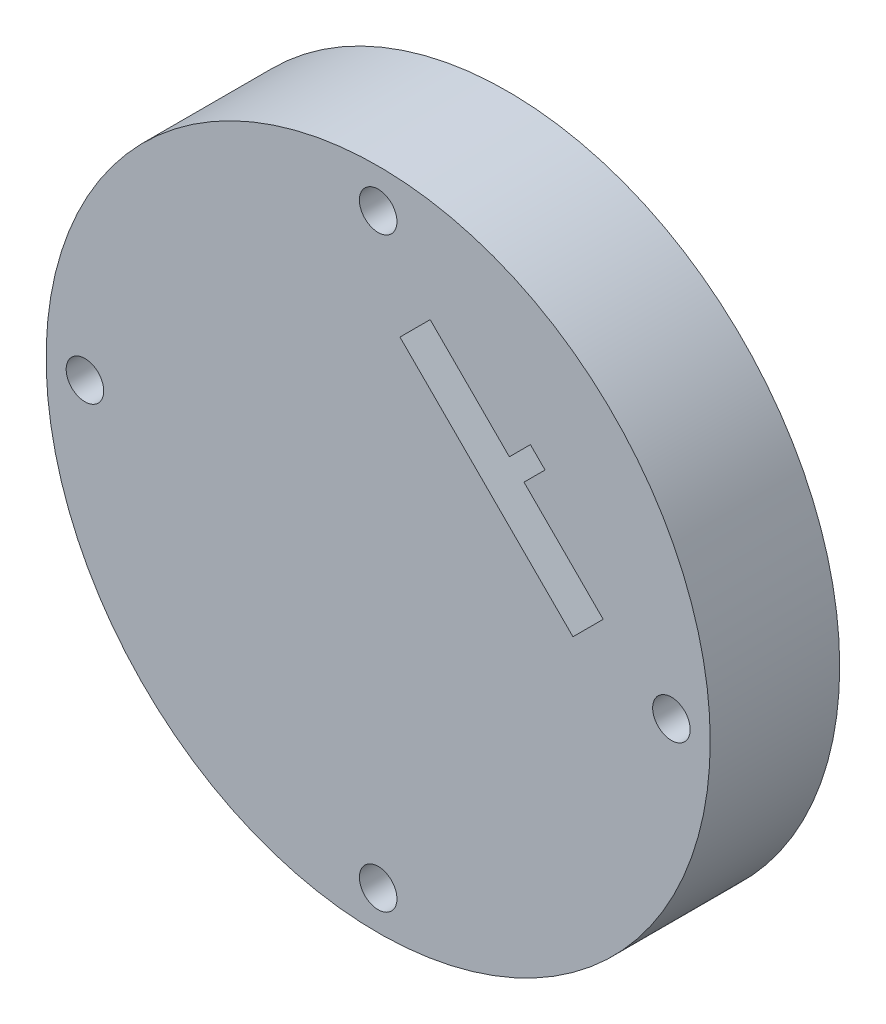
ISO-10303-21;
HEADER;
FILE_DESCRIPTION(('STEP AP214'),'2;1');
FILE_NAME('part.step','',(''),(''),'','','');
FILE_SCHEMA(('AUTOMOTIVE_DESIGN { 1 0 10303 214 1 1 1 1 }'));
ENDSEC;
DATA;
#1=APPLICATION_CONTEXT('core data for automotive mechanical design processes');
#2=APPLICATION_PROTOCOL_DEFINITION('international standard','automotive_design',2000,#1);
#3=PRODUCT_CONTEXT('',#1,'mechanical');
#4=PRODUCT('Part','Part','',(#3));
#5=PRODUCT_RELATED_PRODUCT_CATEGORY('part','',(#4));
#6=PRODUCT_DEFINITION_FORMATION('','',#4);
#7=PRODUCT_DEFINITION_CONTEXT('part definition',#1,'design');
#8=PRODUCT_DEFINITION('design','',#6,#7);
#9=PRODUCT_DEFINITION_SHAPE('','',#8);
#10=(LENGTH_UNIT() NAMED_UNIT(*) SI_UNIT(.MILLI.,.METRE.));
#11=(NAMED_UNIT(*) PLANE_ANGLE_UNIT() SI_UNIT($,.RADIAN.));
#12=(NAMED_UNIT(*) SI_UNIT($,.STERADIAN.) SOLID_ANGLE_UNIT());
#13=UNCERTAINTY_MEASURE_WITH_UNIT(LENGTH_MEASURE(1.E-05),#10,'distance_accuracy_value','');
#14=(GEOMETRIC_REPRESENTATION_CONTEXT(3) GLOBAL_UNCERTAINTY_ASSIGNED_CONTEXT((#13)) GLOBAL_UNIT_ASSIGNED_CONTEXT((#10,
#11,#12)) REPRESENTATION_CONTEXT('',''));
#15=CARTESIAN_POINT('',(0.,0.,0.));
#16=DIRECTION('',(0.,0.,1.));
#17=DIRECTION('',(1.,0.,0.));
#18=AXIS2_PLACEMENT_3D('',#15,#16,#17);
#19=CARTESIAN_POINT('',(0.,0.,10.));
#20=DIRECTION('',(0.,0.,1.));
#21=DIRECTION('',(1.,0.,0.));
#22=AXIS2_PLACEMENT_3D('',#19,#20,#21);
#23=PLANE('',#22);
#24=DIRECTION('',(-0.707106781186547,0.707106781186548,0.));
#25=VECTOR('',#24,1.);
#26=CARTESIAN_POINT('',(17.3806846815653,4.0163665171396,10.));
#27=LINE('',#26,#25);
#28=CARTESIAN_POINT('',(17.3806846815653,4.0163665171396,10.));
#29=VERTEX_POINT('',#28);
#30=CARTESIAN_POINT('',(11.2642110243017,10.1328401744032,10.));
#31=VERTEX_POINT('',#30);
#32=EDGE_CURVE('E54',#29,#31,#27,.T.);
#33=ORIENTED_EDGE('',*,*,#32,.F.);
#34=DIRECTION('',(0.707106781186546,0.707106781186549,0.));
#35=VECTOR('',#34,1.);
#36=CARTESIAN_POINT('',(17.3806846815653,4.0163665171396,10.));
#37=LINE('',#36,#35);
#38=CARTESIAN_POINT('',(15.0472323036497,1.68291413922398,10.));
#39=VERTEX_POINT('',#38);
#40=EDGE_CURVE('E155',#39,#29,#37,.T.);
#41=ORIENTED_EDGE('',*,*,#40,.F.);
#42=DIRECTION('',(0.707106781186548,-0.707106781186548,0.));
#43=VECTOR('',#42,1.);
#44=CARTESIAN_POINT('',(1.68291413922399,15.0472323036497,10.));
#45=LINE('',#44,#43);
#46=CARTESIAN_POINT('',(1.68291413922399,15.0472323036497,10.));
#47=VERTEX_POINT('',#46);
#48=EDGE_CURVE('E153',#47,#39,#45,.T.);
#49=ORIENTED_EDGE('',*,*,#48,.F.);
#50=DIRECTION('',(-0.707106781186547,-0.707106781186548,0.));
#51=VECTOR('',#50,1.);
#52=CARTESIAN_POINT('',(4.01636651713959,17.3806846815653,10.));
#53=LINE('',#52,#51);
#54=CARTESIAN_POINT('',(4.01636651713959,17.3806846815653,10.));
#55=VERTEX_POINT('',#54);
#56=EDGE_CURVE('E114',#55,#47,#53,.T.);
#57=ORIENTED_EDGE('',*,*,#56,.F.);
#58=DIRECTION('',(-0.707106781186548,0.707106781186547,0.));
#59=VECTOR('',#58,1.);
#60=CARTESIAN_POINT('',(10.1328401744032,11.2642110243017,10.));
#61=LINE('',#60,#59);
#62=CARTESIAN_POINT('',(10.1328401744032,11.2642110243017,10.));
#63=VERTEX_POINT('',#62);
#64=EDGE_CURVE('E149',#63,#55,#61,.T.);
#65=ORIENTED_EDGE('',*,*,#64,.F.);
#66=DIRECTION('',(-0.70710678118655,-0.707106781186545,0.));
#67=VECTOR('',#66,1.);
#68=CARTESIAN_POINT('',(10.1328401744032,11.2642110243017,10.));
#69=LINE('',#68,#67);
#70=CARTESIAN_POINT('',(11.7591857711323,12.8905566210308,10.));
#71=VERTEX_POINT('',#70);
#72=EDGE_CURVE('E146',#71,#63,#69,.T.);
#73=ORIENTED_EDGE('',*,*,#72,.F.);
#74=DIRECTION('',(-0.707106781186547,0.707106781186547,0.));
#75=VECTOR('',#74,1.);
#76=CARTESIAN_POINT('',(12.8905566210308,11.7591857711323,10.));
#77=LINE('',#76,#75);
#78=CARTESIAN_POINT('',(12.8905566210308,11.7591857711323,10.));
#79=VERTEX_POINT('',#78);
#80=EDGE_CURVE('E143',#79,#71,#77,.T.);
#81=ORIENTED_EDGE('',*,*,#80,.F.);
#82=DIRECTION('',(0.707106781186547,0.707106781186547,0.));
#83=VECTOR('',#82,1.);
#84=CARTESIAN_POINT('',(11.2642110243017,10.1328401744032,10.));
#85=LINE('',#84,#83);
#86=EDGE_CURVE('E140',#31,#79,#85,.T.);
#87=ORIENTED_EDGE('',*,*,#86,.F.);
#88=EDGE_LOOP('',(#33,#41,#49,#57,#65,#73,#81,#87));
#89=FACE_BOUND('',#88,.T.);
#90=CARTESIAN_POINT('',(2.37246156974391E-13,22.65,10.));
#91=DIRECTION('',(0.,0.,1.));
#92=DIRECTION('',(1.,0.,0.));
#93=AXIS2_PLACEMENT_3D('',#90,#91,#92);
#94=CIRCLE('',#93,1.45);
#95=CARTESIAN_POINT('',(1.45000000000024,22.65,10.));
#96=VERTEX_POINT('',#95);
#97=EDGE_CURVE('E175',#96,#96,#94,.T.);
#98=ORIENTED_EDGE('',*,*,#97,.F.);
#99=EDGE_LOOP('',(#98));
#100=FACE_BOUND('',#99,.T.);
#101=CARTESIAN_POINT('',(0.,-22.65,10.));
#102=DIRECTION('',(0.,0.,1.));
#103=DIRECTION('',(1.,0.,0.));
#104=AXIS2_PLACEMENT_3D('',#101,#102,#103);
#105=CIRCLE('',#104,1.45);
#106=CARTESIAN_POINT('',(1.44999999999992,-22.65,10.));
#107=VERTEX_POINT('',#106);
#108=EDGE_CURVE('E187',#107,#107,#105,.T.);
#109=ORIENTED_EDGE('',*,*,#108,.F.);
#110=EDGE_LOOP('',(#109));
#111=FACE_BOUND('',#110,.T.);
#112=CARTESIAN_POINT('',(0.,0.,10.));
#113=DIRECTION('',(0.,0.,1.));
#114=DIRECTION('',(1.,0.,0.));
#115=AXIS2_PLACEMENT_3D('',#112,#113,#114);
#116=CIRCLE('',#115,25.65);
#117=CARTESIAN_POINT('',(25.65,0.,10.));
#118=VERTEX_POINT('',#117);
#119=EDGE_CURVE('E11',#118,#118,#116,.T.);
#120=ORIENTED_EDGE('',*,*,#119,.T.);
#121=EDGE_LOOP('',(#120));
#122=FACE_BOUND('',#121,.T.);
#123=CARTESIAN_POINT('',(22.65,0.,10.));
#124=DIRECTION('',(0.,0.,1.));
#125=DIRECTION('',(1.,0.,0.));
#126=AXIS2_PLACEMENT_3D('',#123,#124,#125);
#127=CIRCLE('',#126,1.45);
#128=CARTESIAN_POINT('',(24.1,0.,10.));
#129=VERTEX_POINT('',#128);
#130=EDGE_CURVE('E181',#129,#129,#127,.T.);
#131=ORIENTED_EDGE('',*,*,#130,.F.);
#132=EDGE_LOOP('',(#131));
#133=FACE_BOUND('',#132,.T.);
#134=CARTESIAN_POINT('',(-22.65,1.58164104649594E-13,10.));
#135=DIRECTION('',(0.,0.,1.));
#136=DIRECTION('',(1.,0.,0.));
#137=AXIS2_PLACEMENT_3D('',#134,#135,#136);
#138=CIRCLE('',#137,1.45);
#139=CARTESIAN_POINT('',(-21.2,1.58164104649594E-13,10.));
#140=VERTEX_POINT('',#139);
#141=EDGE_CURVE('E169',#140,#140,#138,.T.);
#142=ORIENTED_EDGE('',*,*,#141,.F.);
#143=EDGE_LOOP('',(#142));
#144=FACE_BOUND('',#143,.T.);
#145=ADVANCED_FACE('F39',(#89,#100,#111,#122,#133,#144),#23,.T.);
#146=CARTESIAN_POINT('',(0.,0.,0.));
#147=DIRECTION('',(0.,0.,1.));
#148=DIRECTION('',(1.,0.,0.));
#149=AXIS2_PLACEMENT_3D('',#146,#147,#148);
#150=PLANE('',#149);
#151=CARTESIAN_POINT('',(0.,0.,0.));
#152=DIRECTION('',(0.,0.,1.));
#153=DIRECTION('',(1.,0.,0.));
#154=AXIS2_PLACEMENT_3D('',#151,#152,#153);
#155=CIRCLE('',#154,25.65);
#156=CARTESIAN_POINT('',(25.65,0.,0.));
#157=VERTEX_POINT('',#156);
#158=EDGE_CURVE('E43',#157,#157,#155,.T.);
#159=ORIENTED_EDGE('',*,*,#158,.F.);
#160=EDGE_LOOP('',(#159));
#161=FACE_BOUND('',#160,.T.);
#162=CARTESIAN_POINT('',(0.,-22.65,0.));
#163=DIRECTION('',(0.,0.,1.));
#164=DIRECTION('',(1.,0.,0.));
#165=AXIS2_PLACEMENT_3D('',#162,#163,#164);
#166=CIRCLE('',#165,1.45);
#167=CARTESIAN_POINT('',(1.44999999999992,-22.65,0.));
#168=VERTEX_POINT('',#167);
#169=EDGE_CURVE('E184',#168,#168,#166,.T.);
#170=ORIENTED_EDGE('',*,*,#169,.T.);
#171=EDGE_LOOP('',(#170));
#172=FACE_BOUND('',#171,.T.);
#173=CARTESIAN_POINT('',(22.65,0.,0.));
#174=DIRECTION('',(0.,0.,1.));
#175=DIRECTION('',(1.,0.,0.));
#176=AXIS2_PLACEMENT_3D('',#173,#174,#175);
#177=CIRCLE('',#176,1.45);
#178=CARTESIAN_POINT('',(24.1,0.,0.));
#179=VERTEX_POINT('',#178);
#180=EDGE_CURVE('E178',#179,#179,#177,.T.);
#181=ORIENTED_EDGE('',*,*,#180,.T.);
#182=EDGE_LOOP('',(#181));
#183=FACE_BOUND('',#182,.T.);
#184=CARTESIAN_POINT('',(2.37246156974391E-13,22.65,0.));
#185=DIRECTION('',(0.,0.,1.));
#186=DIRECTION('',(1.,0.,0.));
#187=AXIS2_PLACEMENT_3D('',#184,#185,#186);
#188=CIRCLE('',#187,1.45);
#189=CARTESIAN_POINT('',(1.45000000000024,22.65,0.));
#190=VERTEX_POINT('',#189);
#191=EDGE_CURVE('E172',#190,#190,#188,.T.);
#192=ORIENTED_EDGE('',*,*,#191,.T.);
#193=EDGE_LOOP('',(#192));
#194=FACE_BOUND('',#193,.T.);
#195=CARTESIAN_POINT('',(-22.65,1.58164104649594E-13,0.));
#196=DIRECTION('',(0.,0.,1.));
#197=DIRECTION('',(1.,0.,0.));
#198=AXIS2_PLACEMENT_3D('',#195,#196,#197);
#199=CIRCLE('',#198,1.45);
#200=CARTESIAN_POINT('',(-21.2,1.58164104649594E-13,0.));
#201=VERTEX_POINT('',#200);
#202=EDGE_CURVE('E159',#201,#201,#199,.T.);
#203=ORIENTED_EDGE('',*,*,#202,.T.);
#204=EDGE_LOOP('',(#203));
#205=FACE_BOUND('',#204,.T.);
#206=ADVANCED_FACE('F193',(#161,#172,#183,#194,#205),#150,.F.);
#207=CARTESIAN_POINT('',(0.,0.,10.));
#208=DIRECTION('',(0.,0.,-1.));
#209=DIRECTION('',(-1.,0.,0.));
#210=AXIS2_PLACEMENT_3D('',#207,#208,#209);
#211=CYLINDRICAL_SURFACE('',#210,25.65);
#212=ORIENTED_EDGE('',*,*,#119,.F.);
#213=EDGE_LOOP('',(#212));
#214=FACE_BOUND('',#213,.T.);
#215=ORIENTED_EDGE('',*,*,#158,.T.);
#216=EDGE_LOOP('',(#215));
#217=FACE_BOUND('',#216,.T.);
#218=ADVANCED_FACE('F41',(#214,#217),#211,.T.);
#219=CARTESIAN_POINT('',(0.,-22.65,10.));
#220=DIRECTION('',(0.,0.,-1.));
#221=DIRECTION('',(-1.,0.,0.));
#222=AXIS2_PLACEMENT_3D('',#219,#220,#221);
#223=CYLINDRICAL_SURFACE('',#222,1.45);
#224=ORIENTED_EDGE('',*,*,#108,.T.);
#225=EDGE_LOOP('',(#224));
#226=FACE_BOUND('',#225,.T.);
#227=ORIENTED_EDGE('',*,*,#169,.F.);
#228=EDGE_LOOP('',(#227));
#229=FACE_BOUND('',#228,.T.);
#230=ADVANCED_FACE('F196',(#226,#229),#223,.F.);
#231=CARTESIAN_POINT('',(22.65,0.,10.));
#232=DIRECTION('',(0.,0.,-1.));
#233=DIRECTION('',(-1.,0.,0.));
#234=AXIS2_PLACEMENT_3D('',#231,#232,#233);
#235=CYLINDRICAL_SURFACE('',#234,1.45);
#236=ORIENTED_EDGE('',*,*,#130,.T.);
#237=EDGE_LOOP('',(#236));
#238=FACE_BOUND('',#237,.T.);
#239=ORIENTED_EDGE('',*,*,#180,.F.);
#240=EDGE_LOOP('',(#239));
#241=FACE_BOUND('',#240,.T.);
#242=ADVANCED_FACE('F198',(#238,#241),#235,.F.);
#243=CARTESIAN_POINT('',(2.37246156974391E-13,22.65,10.));
#244=DIRECTION('',(0.,0.,-1.));
#245=DIRECTION('',(-1.,0.,0.));
#246=AXIS2_PLACEMENT_3D('',#243,#244,#245);
#247=CYLINDRICAL_SURFACE('',#246,1.45);
#248=ORIENTED_EDGE('',*,*,#97,.T.);
#249=EDGE_LOOP('',(#248));
#250=FACE_BOUND('',#249,.T.);
#251=ORIENTED_EDGE('',*,*,#191,.F.);
#252=EDGE_LOOP('',(#251));
#253=FACE_BOUND('',#252,.T.);
#254=ADVANCED_FACE('F205',(#250,#253),#247,.F.);
#255=CARTESIAN_POINT('',(-22.65,1.58164104649594E-13,10.));
#256=DIRECTION('',(0.,0.,-1.));
#257=DIRECTION('',(-1.,0.,0.));
#258=AXIS2_PLACEMENT_3D('',#255,#256,#257);
#259=CYLINDRICAL_SURFACE('',#258,1.45);
#260=ORIENTED_EDGE('',*,*,#141,.T.);
#261=EDGE_LOOP('',(#260));
#262=FACE_BOUND('',#261,.T.);
#263=ORIENTED_EDGE('',*,*,#202,.F.);
#264=EDGE_LOOP('',(#263));
#265=FACE_BOUND('',#264,.T.);
#266=ADVANCED_FACE('F231',(#262,#265),#259,.F.);
#267=CARTESIAN_POINT('',(17.3806846815653,4.0163665171396,2.5));
#268=DIRECTION('',(0.707106781186548,0.707106781186547,0.));
#269=DIRECTION('',(-0.707106781186547,0.707106781186548,0.));
#270=AXIS2_PLACEMENT_3D('',#267,#268,#269);
#271=PLANE('',#270);
#272=ORIENTED_EDGE('',*,*,#32,.T.);
#273=DIRECTION('',(0.,0.,1.));
#274=VECTOR('',#273,1.);
#275=CARTESIAN_POINT('',(11.2642110243017,10.1328401744032,2.5));
#276=LINE('',#275,#274);
#277=CARTESIAN_POINT('',(11.2642110243017,10.1328401744032,2.5));
#278=VERTEX_POINT('',#277);
#279=EDGE_CURVE('E90',#278,#31,#276,.T.);
#280=ORIENTED_EDGE('',*,*,#279,.F.);
#281=DIRECTION('',(-0.707106781186547,0.707106781186548,0.));
#282=VECTOR('',#281,1.);
#283=CARTESIAN_POINT('',(17.3806846815653,4.0163665171396,2.5));
#284=LINE('',#283,#282);
#285=CARTESIAN_POINT('',(17.3806846815653,4.0163665171396,2.5));
#286=VERTEX_POINT('',#285);
#287=EDGE_CURVE('E157',#286,#278,#284,.T.);
#288=ORIENTED_EDGE('',*,*,#287,.F.);
#289=DIRECTION('',(0.,0.,1.));
#290=VECTOR('',#289,1.);
#291=CARTESIAN_POINT('',(17.3806846815653,4.0163665171396,2.5));
#292=LINE('',#291,#290);
#293=EDGE_CURVE('E62',#286,#29,#292,.T.);
#294=ORIENTED_EDGE('',*,*,#293,.T.);
#295=EDGE_LOOP('',(#272,#280,#288,#294));
#296=FACE_BOUND('',#295,.T.);
#297=ADVANCED_FACE('F233',(#296),#271,.F.);
#298=CARTESIAN_POINT('',(17.3806846815653,4.0163665171396,2.5));
#299=DIRECTION('',(0.707106781186549,-0.707106781186546,0.));
#300=DIRECTION('',(0.707106781186546,0.707106781186549,0.));
#301=AXIS2_PLACEMENT_3D('',#298,#299,#300);
#302=PLANE('',#301);
#303=ORIENTED_EDGE('',*,*,#40,.T.);
#304=ORIENTED_EDGE('',*,*,#293,.F.);
#305=DIRECTION('',(0.707106781186546,0.707106781186549,0.));
#306=VECTOR('',#305,1.);
#307=CARTESIAN_POINT('',(17.3806846815653,4.0163665171396,2.5));
#308=LINE('',#307,#306);
#309=CARTESIAN_POINT('',(15.0472323036497,1.68291413922398,2.5));
#310=VERTEX_POINT('',#309);
#311=EDGE_CURVE('E126',#310,#286,#308,.T.);
#312=ORIENTED_EDGE('',*,*,#311,.F.);
#313=DIRECTION('',(0.,0.,1.));
#314=VECTOR('',#313,1.);
#315=CARTESIAN_POINT('',(15.0472323036497,1.68291413922398,2.5));
#316=LINE('',#315,#314);
#317=EDGE_CURVE('E118',#310,#39,#316,.T.);
#318=ORIENTED_EDGE('',*,*,#317,.T.);
#319=EDGE_LOOP('',(#303,#304,#312,#318));
#320=FACE_BOUND('',#319,.T.);
#321=ADVANCED_FACE('F240',(#320),#302,.F.);
#322=CARTESIAN_POINT('',(1.68291413922399,15.0472323036497,2.5));
#323=DIRECTION('',(-0.707106781186547,-0.707106781186547,0.));
#324=DIRECTION('',(0.707106781186548,-0.707106781186548,0.));
#325=AXIS2_PLACEMENT_3D('',#322,#323,#324);
#326=PLANE('',#325);
#327=ORIENTED_EDGE('',*,*,#48,.T.);
#328=ORIENTED_EDGE('',*,*,#317,.F.);
#329=DIRECTION('',(0.707106781186548,-0.707106781186548,0.));
#330=VECTOR('',#329,1.);
#331=CARTESIAN_POINT('',(1.68291413922399,15.0472323036497,2.5));
#332=LINE('',#331,#330);
#333=CARTESIAN_POINT('',(1.68291413922399,15.0472323036497,2.5));
#334=VERTEX_POINT('',#333);
#335=EDGE_CURVE('E122',#334,#310,#332,.T.);
#336=ORIENTED_EDGE('',*,*,#335,.F.);
#337=DIRECTION('',(0.,0.,1.));
#338=VECTOR('',#337,1.);
#339=CARTESIAN_POINT('',(1.68291413922399,15.0472323036497,2.5));
#340=LINE('',#339,#338);
#341=EDGE_CURVE('E107',#334,#47,#340,.T.);
#342=ORIENTED_EDGE('',*,*,#341,.T.);
#343=EDGE_LOOP('',(#327,#328,#336,#342));
#344=FACE_BOUND('',#343,.T.);
#345=ADVANCED_FACE('F123',(#344),#326,.F.);
#346=CARTESIAN_POINT('',(4.01636651713959,17.3806846815653,2.5));
#347=DIRECTION('',(-0.707106781186548,0.707106781186547,0.));
#348=DIRECTION('',(-0.707106781186547,-0.707106781186548,0.));
#349=AXIS2_PLACEMENT_3D('',#346,#347,#348);
#350=PLANE('',#349);
#351=ORIENTED_EDGE('',*,*,#56,.T.);
#352=ORIENTED_EDGE('',*,*,#341,.F.);
#353=DIRECTION('',(-0.707106781186547,-0.707106781186548,0.));
#354=VECTOR('',#353,1.);
#355=CARTESIAN_POINT('',(4.01636651713959,17.3806846815653,2.5));
#356=LINE('',#355,#354);
#357=CARTESIAN_POINT('',(4.01636651713959,17.3806846815653,2.5));
#358=VERTEX_POINT('',#357);
#359=EDGE_CURVE('E111',#358,#334,#356,.T.);
#360=ORIENTED_EDGE('',*,*,#359,.F.);
#361=DIRECTION('',(0.,0.,1.));
#362=VECTOR('',#361,1.);
#363=CARTESIAN_POINT('',(4.01636651713959,17.3806846815653,2.5));
#364=LINE('',#363,#362);
#365=EDGE_CURVE('E119',#358,#55,#364,.T.);
#366=ORIENTED_EDGE('',*,*,#365,.T.);
#367=EDGE_LOOP('',(#351,#352,#360,#366));
#368=FACE_BOUND('',#367,.T.);
#369=ADVANCED_FACE('F109',(#368),#350,.F.);
#370=CARTESIAN_POINT('',(10.1328401744032,11.2642110243017,2.5));
#371=DIRECTION('',(0.707106781186547,0.707106781186548,0.));
#372=DIRECTION('',(-0.707106781186548,0.707106781186547,0.));
#373=AXIS2_PLACEMENT_3D('',#370,#371,#372);
#374=PLANE('',#373);
#375=ORIENTED_EDGE('',*,*,#64,.T.);
#376=ORIENTED_EDGE('',*,*,#365,.F.);
#377=DIRECTION('',(-0.707106781186548,0.707106781186547,0.));
#378=VECTOR('',#377,1.);
#379=CARTESIAN_POINT('',(10.1328401744032,11.2642110243017,2.5));
#380=LINE('',#379,#378);
#381=CARTESIAN_POINT('',(10.1328401744032,11.2642110243017,2.5));
#382=VERTEX_POINT('',#381);
#383=EDGE_CURVE('E132',#382,#358,#380,.T.);
#384=ORIENTED_EDGE('',*,*,#383,.F.);
#385=DIRECTION('',(0.,0.,1.));
#386=VECTOR('',#385,1.);
#387=CARTESIAN_POINT('',(10.1328401744032,11.2642110243017,2.5));
#388=LINE('',#387,#386);
#389=EDGE_CURVE('E162',#382,#63,#388,.T.);
#390=ORIENTED_EDGE('',*,*,#389,.T.);
#391=EDGE_LOOP('',(#375,#376,#384,#390));
#392=FACE_BOUND('',#391,.T.);
#393=ADVANCED_FACE('F256',(#392),#374,.F.);
#394=CARTESIAN_POINT('',(10.1328401744032,11.2642110243017,2.5));
#395=DIRECTION('',(-0.707106781186545,0.70710678118655,0.));
#396=DIRECTION('',(-0.70710678118655,-0.707106781186545,0.));
#397=AXIS2_PLACEMENT_3D('',#394,#395,#396);
#398=PLANE('',#397);
#399=ORIENTED_EDGE('',*,*,#72,.T.);
#400=ORIENTED_EDGE('',*,*,#389,.F.);
#401=DIRECTION('',(-0.70710678118655,-0.707106781186545,0.));
#402=VECTOR('',#401,1.);
#403=CARTESIAN_POINT('',(10.1328401744032,11.2642110243017,2.5));
#404=LINE('',#403,#402);
#405=CARTESIAN_POINT('',(11.7591857711323,12.8905566210308,2.5));
#406=VERTEX_POINT('',#405);
#407=EDGE_CURVE('E134',#406,#382,#404,.T.);
#408=ORIENTED_EDGE('',*,*,#407,.F.);
#409=DIRECTION('',(0.,0.,1.));
#410=VECTOR('',#409,1.);
#411=CARTESIAN_POINT('',(11.7591857711323,12.8905566210308,2.5));
#412=LINE('',#411,#410);
#413=EDGE_CURVE('E164',#406,#71,#412,.T.);
#414=ORIENTED_EDGE('',*,*,#413,.T.);
#415=EDGE_LOOP('',(#399,#400,#408,#414));
#416=FACE_BOUND('',#415,.T.);
#417=ADVANCED_FACE('F252',(#416),#398,.F.);
#418=CARTESIAN_POINT('',(12.8905566210308,11.7591857711323,2.5));
#419=DIRECTION('',(0.707106781186548,0.707106781186548,0.));
#420=DIRECTION('',(-0.707106781186548,0.707106781186548,0.));
#421=AXIS2_PLACEMENT_3D('',#418,#419,#420);
#422=PLANE('',#421);
#423=ORIENTED_EDGE('',*,*,#80,.T.);
#424=ORIENTED_EDGE('',*,*,#413,.F.);
#425=DIRECTION('',(-0.707106781186547,0.707106781186547,0.));
#426=VECTOR('',#425,1.);
#427=CARTESIAN_POINT('',(12.8905566210308,11.7591857711323,2.5));
#428=LINE('',#427,#426);
#429=CARTESIAN_POINT('',(12.8905566210308,11.7591857711323,2.5));
#430=VERTEX_POINT('',#429);
#431=EDGE_CURVE('E366',#430,#406,#428,.T.);
#432=ORIENTED_EDGE('',*,*,#431,.F.);
#433=DIRECTION('',(0.,0.,1.));
#434=VECTOR('',#433,1.);
#435=CARTESIAN_POINT('',(12.8905566210308,11.7591857711323,2.5));
#436=LINE('',#435,#434);
#437=EDGE_CURVE('E166',#430,#79,#436,.T.);
#438=ORIENTED_EDGE('',*,*,#437,.T.);
#439=EDGE_LOOP('',(#423,#424,#432,#438));
#440=FACE_BOUND('',#439,.T.);
#441=ADVANCED_FACE('F248',(#440),#422,.F.);
#442=CARTESIAN_POINT('',(11.2642110243017,10.1328401744032,2.5));
#443=DIRECTION('',(0.707106781186547,-0.707106781186547,0.));
#444=DIRECTION('',(0.707106781186548,0.707106781186548,0.));
#445=AXIS2_PLACEMENT_3D('',#442,#443,#444);
#446=PLANE('',#445);
#447=ORIENTED_EDGE('',*,*,#86,.T.);
#448=ORIENTED_EDGE('',*,*,#437,.F.);
#449=DIRECTION('',(0.707106781186547,0.707106781186547,0.));
#450=VECTOR('',#449,1.);
#451=CARTESIAN_POINT('',(11.2642110243017,10.1328401744032,2.5));
#452=LINE('',#451,#450);
#453=EDGE_CURVE('E365',#278,#430,#452,.T.);
#454=ORIENTED_EDGE('',*,*,#453,.F.);
#455=ORIENTED_EDGE('',*,*,#279,.T.);
#456=EDGE_LOOP('',(#447,#448,#454,#455));
#457=FACE_BOUND('',#456,.T.);
#458=ADVANCED_FACE('F245',(#457),#446,.F.);
#459=CARTESIAN_POINT('',(0.,0.,2.5));
#460=DIRECTION('',(0.,0.,-1.));
#461=DIRECTION('',(-1.,0.,0.));
#462=AXIS2_PLACEMENT_3D('',#459,#460,#461);
#463=PLANE('',#462);
#464=ORIENTED_EDGE('',*,*,#287,.T.);
#465=ORIENTED_EDGE('',*,*,#453,.T.);
#466=ORIENTED_EDGE('',*,*,#431,.T.);
#467=ORIENTED_EDGE('',*,*,#407,.T.);
#468=ORIENTED_EDGE('',*,*,#383,.T.);
#469=ORIENTED_EDGE('',*,*,#359,.T.);
#470=ORIENTED_EDGE('',*,*,#335,.T.);
#471=ORIENTED_EDGE('',*,*,#311,.T.);
#472=EDGE_LOOP('',(#464,#465,#466,#467,#468,#469,#470,#471));
#473=FACE_BOUND('',#472,.T.);
#474=ADVANCED_FACE('F129',(#473),#463,.F.);
#475=CLOSED_SHELL('',(#145,#206,#218,#230,#242,#254,#266,#297,#321,#345,#369,#393,#417,#441,
#458,#474));
#476=MANIFOLD_SOLID_BREP('B2',#475);
#477=ADVANCED_BREP_SHAPE_REPRESENTATION('',(#18,#476),#14);
#478=SHAPE_DEFINITION_REPRESENTATION(#9,#477);
ENDSEC;
END-ISO-10303-21;
